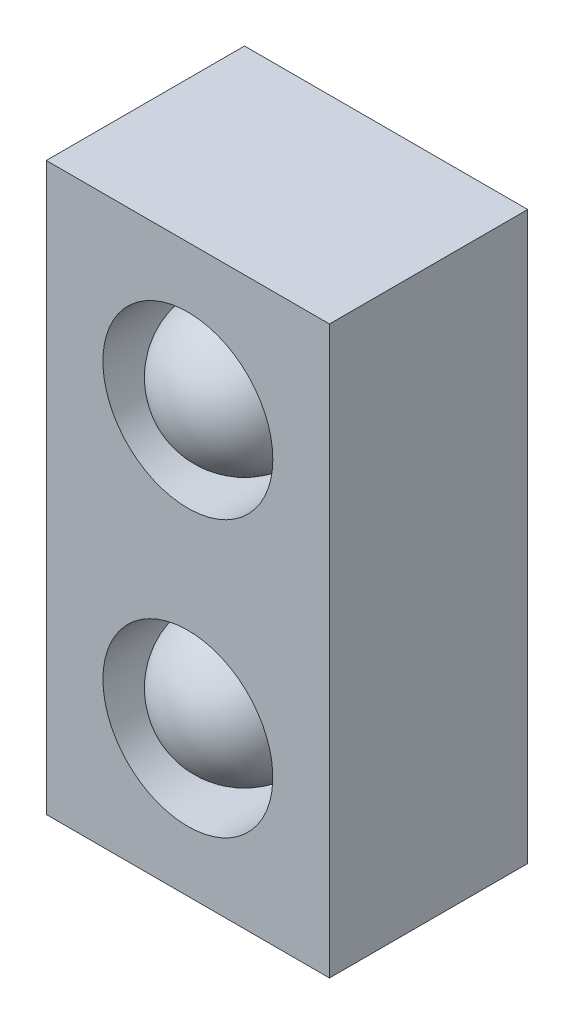
ISO-10303-21;
HEADER;
FILE_DESCRIPTION(('STEP AP214'),'2;1');
FILE_NAME('part.step','',(''),(''),'','','');
FILE_SCHEMA(('AUTOMOTIVE_DESIGN { 1 0 10303 214 1 1 1 1 }'));
ENDSEC;
DATA;
#1=APPLICATION_CONTEXT('core data for automotive mechanical design processes');
#2=APPLICATION_PROTOCOL_DEFINITION('international standard','automotive_design',2000,#1);
#3=PRODUCT_CONTEXT('',#1,'mechanical');
#4=PRODUCT('Part','Part','',(#3));
#5=PRODUCT_RELATED_PRODUCT_CATEGORY('part','',(#4));
#6=PRODUCT_DEFINITION_FORMATION('','',#4);
#7=PRODUCT_DEFINITION_CONTEXT('part definition',#1,'design');
#8=PRODUCT_DEFINITION('design','',#6,#7);
#9=PRODUCT_DEFINITION_SHAPE('','',#8);
#10=(LENGTH_UNIT() NAMED_UNIT(*) SI_UNIT(.MILLI.,.METRE.));
#11=(NAMED_UNIT(*) PLANE_ANGLE_UNIT() SI_UNIT($,.RADIAN.));
#12=(NAMED_UNIT(*) SI_UNIT($,.STERADIAN.) SOLID_ANGLE_UNIT());
#13=UNCERTAINTY_MEASURE_WITH_UNIT(LENGTH_MEASURE(1.E-05),#10,'distance_accuracy_value','');
#14=(GEOMETRIC_REPRESENTATION_CONTEXT(3) GLOBAL_UNCERTAINTY_ASSIGNED_CONTEXT((#13)) GLOBAL_UNIT_ASSIGNED_CONTEXT((#10,
#11,#12)) REPRESENTATION_CONTEXT('',''));
#15=CARTESIAN_POINT('',(0.,0.,0.));
#16=DIRECTION('',(0.,0.,1.));
#17=DIRECTION('',(1.,0.,0.));
#18=AXIS2_PLACEMENT_3D('',#15,#16,#17);
#19=CARTESIAN_POINT('',(0.,-4.63487276613991,5.));
#20=DIRECTION('',(0.,0.,-1.));
#21=DIRECTION('',(-1.,0.,0.));
#22=AXIS2_PLACEMENT_3D('',#19,#20,#21);
#23=CYLINDRICAL_SURFACE('',#22,2.5);
#24=CARTESIAN_POINT('',(0.,-4.63487276613991,5.));
#25=DIRECTION('',(0.,0.,-1.));
#26=DIRECTION('',(1.,0.,0.));
#27=AXIS2_PLACEMENT_3D('',#24,#25,#26);
#28=CIRCLE('',#27,2.5);
#29=CARTESIAN_POINT('',(2.5,-4.63487276613991,5.));
#30=VERTEX_POINT('',#29);
#31=EDGE_CURVE('E52',#30,#30,#28,.T.);
#32=ORIENTED_EDGE('',*,*,#31,.T.);
#33=EDGE_LOOP('',(#32));
#34=FACE_BOUND('',#33,.T.);
#35=CARTESIAN_POINT('',(0.,-4.63487276613991,0.));
#36=DIRECTION('',(0.,0.,-1.));
#37=DIRECTION('',(-1.,0.,0.));
#38=AXIS2_PLACEMENT_3D('',#35,#36,#37);
#39=CIRCLE('',#38,2.5);
#40=CARTESIAN_POINT('',(-2.5,-4.63487276613991,0.));
#41=VERTEX_POINT('',#40);
#42=EDGE_CURVE('E11',#41,#41,#39,.T.);
#43=ORIENTED_EDGE('',*,*,#42,.F.);
#44=EDGE_LOOP('',(#43));
#45=FACE_BOUND('',#44,.T.);
#46=ADVANCED_FACE('F46',(#34,#45),#23,.T.);
#47=CARTESIAN_POINT('',(0.,-4.63487276613991,0.));
#48=DIRECTION('',(0.,0.,-1.));
#49=DIRECTION('',(-1.,0.,0.));
#50=AXIS2_PLACEMENT_3D('',#47,#48,#49);
#51=PLANE('',#50);
#52=ORIENTED_EDGE('',*,*,#42,.T.);
#53=EDGE_LOOP('',(#52));
#54=FACE_BOUND('',#53,.T.);
#55=ADVANCED_FACE('F62',(#54),#51,.T.);
#56=CARTESIAN_POINT('',(0.,-4.63487276613991,5.));
#57=DIRECTION('',(-1.,0.,0.));
#58=DIRECTION('',(0.,-1.,0.));
#59=AXIS2_PLACEMENT_3D('',#56,#57,#58);
#60=SPHERICAL_SURFACE('',#59,2.5);
#61=CARTESIAN_POINT('',(0.,-4.63487276613991,5.));
#62=DIRECTION('',(0.,0.,-1.));
#63=DIRECTION('',(1.,0.,0.));
#64=AXIS2_PLACEMENT_3D('',#61,#62,#63);
#65=SPHERICAL_SURFACE('',#64,2.5);
#66=ORIENTED_EDGE('',*,*,#31,.F.);
#67=EDGE_LOOP('',(#66));
#68=FACE_BOUND('',#67,.T.);
#69=ADVANCED_FACE('F60',(#68),#65,.T.);
#70=CLOSED_SHELL('',(#46,#55,#69));
#71=MANIFOLD_SOLID_BREP('B2',#70);
#72=CARTESIAN_POINT('',(0.,4.86512723386009,5.));
#73=DIRECTION('',(0.,0.,-1.));
#74=DIRECTION('',(-1.,0.,0.));
#75=AXIS2_PLACEMENT_3D('',#72,#73,#74);
#76=CYLINDRICAL_SURFACE('',#75,2.5);
#77=CARTESIAN_POINT('',(0.,4.86512723386009,5.));
#78=DIRECTION('',(0.,0.,-1.));
#79=DIRECTION('',(1.,0.,0.));
#80=AXIS2_PLACEMENT_3D('',#77,#78,#79);
#81=CIRCLE('',#80,2.5);
#82=CARTESIAN_POINT('',(2.5,4.86512723386009,5.));
#83=VERTEX_POINT('',#82);
#84=EDGE_CURVE('E102',#83,#83,#81,.T.);
#85=ORIENTED_EDGE('',*,*,#84,.T.);
#86=EDGE_LOOP('',(#85));
#87=FACE_BOUND('',#86,.T.);
#88=CARTESIAN_POINT('',(0.,4.86512723386009,0.));
#89=DIRECTION('',(0.,0.,-1.));
#90=DIRECTION('',(-1.,0.,0.));
#91=AXIS2_PLACEMENT_3D('',#88,#89,#90);
#92=CIRCLE('',#91,2.5);
#93=CARTESIAN_POINT('',(-2.5,4.86512723386009,0.));
#94=VERTEX_POINT('',#93);
#95=EDGE_CURVE('E45',#94,#94,#92,.T.);
#96=ORIENTED_EDGE('',*,*,#95,.F.);
#97=EDGE_LOOP('',(#96));
#98=FACE_BOUND('',#97,.T.);
#99=ADVANCED_FACE('F96',(#87,#98),#76,.T.);
#100=CARTESIAN_POINT('',(0.,4.86512723386009,0.));
#101=DIRECTION('',(0.,0.,-1.));
#102=DIRECTION('',(-1.,0.,0.));
#103=AXIS2_PLACEMENT_3D('',#100,#101,#102);
#104=PLANE('',#103);
#105=ORIENTED_EDGE('',*,*,#95,.T.);
#106=EDGE_LOOP('',(#105));
#107=FACE_BOUND('',#106,.T.);
#108=ADVANCED_FACE('F112',(#107),#104,.T.);
#109=CARTESIAN_POINT('',(0.,4.86512723386009,5.));
#110=DIRECTION('',(-1.,0.,0.));
#111=DIRECTION('',(0.,-1.,0.));
#112=AXIS2_PLACEMENT_3D('',#109,#110,#111);
#113=SPHERICAL_SURFACE('',#112,2.5);
#114=CARTESIAN_POINT('',(0.,4.86512723386009,5.));
#115=DIRECTION('',(0.,0.,-1.));
#116=DIRECTION('',(1.,0.,0.));
#117=AXIS2_PLACEMENT_3D('',#114,#115,#116);
#118=SPHERICAL_SURFACE('',#117,2.5);
#119=ORIENTED_EDGE('',*,*,#84,.F.);
#120=EDGE_LOOP('',(#119));
#121=FACE_BOUND('',#120,.T.);
#122=ADVANCED_FACE('F110',(#121),#118,.T.);
#123=CLOSED_SHELL('',(#99,#108,#122));
#124=MANIFOLD_SOLID_BREP('B6',#123);
#125=CARTESIAN_POINT('',(0.,0.,7.));
#126=DIRECTION('',(0.,0.,-1.));
#127=DIRECTION('',(-1.,0.,0.));
#128=AXIS2_PLACEMENT_3D('',#125,#126,#127);
#129=PLANE('',#128);
#130=DIRECTION('',(0.,1.,0.));
#131=VECTOR('',#130,1.);
#132=CARTESIAN_POINT('',(5.,-10.,7.));
#133=LINE('',#132,#131);
#134=CARTESIAN_POINT('',(5.,-10.,7.));
#135=VERTEX_POINT('',#134);
#136=CARTESIAN_POINT('',(5.,10.,7.));
#137=VERTEX_POINT('',#136);
#138=EDGE_CURVE('E189',#135,#137,#133,.T.);
#139=ORIENTED_EDGE('',*,*,#138,.T.);
#140=DIRECTION('',(-1.,0.,0.));
#141=VECTOR('',#140,1.);
#142=CARTESIAN_POINT('',(-5.,10.,7.));
#143=LINE('',#142,#141);
#144=CARTESIAN_POINT('',(-5.,10.,7.));
#145=VERTEX_POINT('',#144);
#146=EDGE_CURVE('E184',#137,#145,#143,.T.);
#147=ORIENTED_EDGE('',*,*,#146,.T.);
#148=DIRECTION('',(0.,-1.,0.));
#149=VECTOR('',#148,1.);
#150=CARTESIAN_POINT('',(-5.,-10.,7.));
#151=LINE('',#150,#149);
#152=CARTESIAN_POINT('',(-5.,-10.,7.));
#153=VERTEX_POINT('',#152);
#154=EDGE_CURVE('E187',#145,#153,#151,.T.);
#155=ORIENTED_EDGE('',*,*,#154,.T.);
#156=DIRECTION('',(1.,0.,0.));
#157=VECTOR('',#156,1.);
#158=CARTESIAN_POINT('',(-5.,-10.,7.));
#159=LINE('',#158,#157);
#160=EDGE_CURVE('E154',#153,#135,#159,.T.);
#161=ORIENTED_EDGE('',*,*,#160,.T.);
#162=EDGE_LOOP('',(#139,#147,#155,#161));
#163=FACE_BOUND('',#162,.T.);
#164=CARTESIAN_POINT('',(0.,4.86512723386009,7.));
#165=DIRECTION('',(0.,0.,1.));
#166=DIRECTION('',(1.,0.,0.));
#167=AXIS2_PLACEMENT_3D('',#164,#165,#166);
#168=CIRCLE('',#167,3.);
#169=CARTESIAN_POINT('',(3.,4.86512723386009,7.));
#170=VERTEX_POINT('',#169);
#171=EDGE_CURVE('E204',#170,#170,#168,.T.);
#172=ORIENTED_EDGE('',*,*,#171,.F.);
#173=EDGE_LOOP('',(#172));
#174=FACE_BOUND('',#173,.T.);
#175=CARTESIAN_POINT('',(0.,-4.86512723386009,7.));
#176=DIRECTION('',(0.,0.,1.));
#177=DIRECTION('',(-1.,0.,0.));
#178=AXIS2_PLACEMENT_3D('',#175,#176,#177);
#179=CIRCLE('',#178,3.);
#180=CARTESIAN_POINT('',(-3.,-4.86512723386009,7.));
#181=VERTEX_POINT('',#180);
#182=EDGE_CURVE('E219',#181,#181,#179,.T.);
#183=ORIENTED_EDGE('',*,*,#182,.F.);
#184=EDGE_LOOP('',(#183));
#185=FACE_BOUND('',#184,.T.);
#186=ADVANCED_FACE('F137',(#163,#174,#185),#129,.F.);
#187=CARTESIAN_POINT('',(0.,0.,0.));
#188=DIRECTION('',(0.,0.,-1.));
#189=DIRECTION('',(-1.,0.,0.));
#190=AXIS2_PLACEMENT_3D('',#187,#188,#189);
#191=PLANE('',#190);
#192=CARTESIAN_POINT('',(0.,4.86512723386009,0.));
#193=DIRECTION('',(0.,0.,1.));
#194=DIRECTION('',(1.,0.,0.));
#195=AXIS2_PLACEMENT_3D('',#192,#193,#194);
#196=CIRCLE('',#195,3.);
#197=CARTESIAN_POINT('',(3.,4.86512723386009,0.));
#198=VERTEX_POINT('',#197);
#199=EDGE_CURVE('E216',#198,#198,#196,.T.);
#200=ORIENTED_EDGE('',*,*,#199,.T.);
#201=EDGE_LOOP('',(#200));
#202=FACE_BOUND('',#201,.T.);
#203=DIRECTION('',(0.,1.,0.));
#204=VECTOR('',#203,1.);
#205=CARTESIAN_POINT('',(5.,-10.,0.));
#206=LINE('',#205,#204);
#207=CARTESIAN_POINT('',(5.,-10.,0.));
#208=VERTEX_POINT('',#207);
#209=CARTESIAN_POINT('',(5.,10.,0.));
#210=VERTEX_POINT('',#209);
#211=EDGE_CURVE('E201',#208,#210,#206,.T.);
#212=ORIENTED_EDGE('',*,*,#211,.F.);
#213=DIRECTION('',(1.,0.,0.));
#214=VECTOR('',#213,1.);
#215=CARTESIAN_POINT('',(-5.,-10.,0.));
#216=LINE('',#215,#214);
#217=CARTESIAN_POINT('',(-5.,-10.,0.));
#218=VERTEX_POINT('',#217);
#219=EDGE_CURVE('E177',#218,#208,#216,.T.);
#220=ORIENTED_EDGE('',*,*,#219,.F.);
#221=DIRECTION('',(0.,-1.,0.));
#222=VECTOR('',#221,1.);
#223=CARTESIAN_POINT('',(-5.,-10.,0.));
#224=LINE('',#223,#222);
#225=CARTESIAN_POINT('',(-5.,10.,0.));
#226=VERTEX_POINT('',#225);
#227=EDGE_CURVE('E171',#226,#218,#224,.T.);
#228=ORIENTED_EDGE('',*,*,#227,.F.);
#229=DIRECTION('',(-1.,0.,0.));
#230=VECTOR('',#229,1.);
#231=CARTESIAN_POINT('',(-5.,10.,0.));
#232=LINE('',#231,#230);
#233=EDGE_CURVE('E193',#210,#226,#232,.T.);
#234=ORIENTED_EDGE('',*,*,#233,.F.);
#235=EDGE_LOOP('',(#212,#220,#228,#234));
#236=FACE_BOUND('',#235,.T.);
#237=CARTESIAN_POINT('',(0.,-4.86512723386009,0.));
#238=DIRECTION('',(0.,0.,1.));
#239=DIRECTION('',(-1.,0.,0.));
#240=AXIS2_PLACEMENT_3D('',#237,#238,#239);
#241=CIRCLE('',#240,3.);
#242=CARTESIAN_POINT('',(-3.,-4.86512723386009,0.));
#243=VERTEX_POINT('',#242);
#244=EDGE_CURVE('E222',#243,#243,#241,.T.);
#245=ORIENTED_EDGE('',*,*,#244,.T.);
#246=EDGE_LOOP('',(#245));
#247=FACE_BOUND('',#246,.T.);
#248=ADVANCED_FACE('F212',(#202,#236,#247),#191,.T.);
#249=CARTESIAN_POINT('',(5.,-10.,7.));
#250=DIRECTION('',(-1.,0.,0.));
#251=DIRECTION('',(0.,0.,1.));
#252=AXIS2_PLACEMENT_3D('',#249,#250,#251);
#253=PLANE('',#252);
#254=ORIENTED_EDGE('',*,*,#211,.T.);
#255=DIRECTION('',(0.,0.,-1.));
#256=VECTOR('',#255,1.);
#257=CARTESIAN_POINT('',(5.,10.,7.));
#258=LINE('',#257,#256);
#259=EDGE_CURVE('E94',#137,#210,#258,.T.);
#260=ORIENTED_EDGE('',*,*,#259,.F.);
#261=ORIENTED_EDGE('',*,*,#138,.F.);
#262=DIRECTION('',(0.,0.,-1.));
#263=VECTOR('',#262,1.);
#264=CARTESIAN_POINT('',(5.,-10.,7.));
#265=LINE('',#264,#263);
#266=EDGE_CURVE('E197',#135,#208,#265,.T.);
#267=ORIENTED_EDGE('',*,*,#266,.T.);
#268=EDGE_LOOP('',(#254,#260,#261,#267));
#269=FACE_BOUND('',#268,.T.);
#270=ADVANCED_FACE('F139',(#269),#253,.F.);
#271=CARTESIAN_POINT('',(-5.,10.,7.));
#272=DIRECTION('',(0.,-1.,0.));
#273=DIRECTION('',(0.,0.,-1.));
#274=AXIS2_PLACEMENT_3D('',#271,#272,#273);
#275=PLANE('',#274);
#276=ORIENTED_EDGE('',*,*,#233,.T.);
#277=DIRECTION('',(0.,0.,-1.));
#278=VECTOR('',#277,1.);
#279=CARTESIAN_POINT('',(-5.,10.,7.));
#280=LINE('',#279,#278);
#281=EDGE_CURVE('E146',#145,#226,#280,.T.);
#282=ORIENTED_EDGE('',*,*,#281,.F.);
#283=ORIENTED_EDGE('',*,*,#146,.F.);
#284=ORIENTED_EDGE('',*,*,#259,.T.);
#285=EDGE_LOOP('',(#276,#282,#283,#284));
#286=FACE_BOUND('',#285,.T.);
#287=ADVANCED_FACE('F192',(#286),#275,.F.);
#288=CARTESIAN_POINT('',(-5.,-10.,7.));
#289=DIRECTION('',(1.,0.,0.));
#290=DIRECTION('',(0.,0.,-1.));
#291=AXIS2_PLACEMENT_3D('',#288,#289,#290);
#292=PLANE('',#291);
#293=ORIENTED_EDGE('',*,*,#227,.T.);
#294=DIRECTION('',(0.,0.,-1.));
#295=VECTOR('',#294,1.);
#296=CARTESIAN_POINT('',(-5.,-10.,7.));
#297=LINE('',#296,#295);
#298=EDGE_CURVE('E194',#153,#218,#297,.T.);
#299=ORIENTED_EDGE('',*,*,#298,.F.);
#300=ORIENTED_EDGE('',*,*,#154,.F.);
#301=ORIENTED_EDGE('',*,*,#281,.T.);
#302=EDGE_LOOP('',(#293,#299,#300,#301));
#303=FACE_BOUND('',#302,.T.);
#304=ADVANCED_FACE('F195',(#303),#292,.F.);
#305=CARTESIAN_POINT('',(-5.,-10.,7.));
#306=DIRECTION('',(0.,1.,0.));
#307=DIRECTION('',(0.,0.,1.));
#308=AXIS2_PLACEMENT_3D('',#305,#306,#307);
#309=PLANE('',#308);
#310=ORIENTED_EDGE('',*,*,#219,.T.);
#311=ORIENTED_EDGE('',*,*,#266,.F.);
#312=ORIENTED_EDGE('',*,*,#160,.F.);
#313=ORIENTED_EDGE('',*,*,#298,.T.);
#314=EDGE_LOOP('',(#310,#311,#312,#313));
#315=FACE_BOUND('',#314,.T.);
#316=ADVANCED_FACE('F209',(#315),#309,.F.);
#317=CARTESIAN_POINT('',(0.,4.86512723386009,7.));
#318=DIRECTION('',(0.,0.,-1.));
#319=DIRECTION('',(-1.,0.,0.));
#320=AXIS2_PLACEMENT_3D('',#317,#318,#319);
#321=CYLINDRICAL_SURFACE('',#320,3.);
#322=ORIENTED_EDGE('',*,*,#171,.T.);
#323=EDGE_LOOP('',(#322));
#324=FACE_BOUND('',#323,.T.);
#325=ORIENTED_EDGE('',*,*,#199,.F.);
#326=EDGE_LOOP('',(#325));
#327=FACE_BOUND('',#326,.T.);
#328=ADVANCED_FACE('F239',(#324,#327),#321,.F.);
#329=CARTESIAN_POINT('',(0.,-4.86512723386009,7.));
#330=DIRECTION('',(0.,0.,-1.));
#331=DIRECTION('',(-1.,0.,0.));
#332=AXIS2_PLACEMENT_3D('',#329,#330,#331);
#333=CYLINDRICAL_SURFACE('',#332,3.);
#334=ORIENTED_EDGE('',*,*,#182,.T.);
#335=EDGE_LOOP('',(#334));
#336=FACE_BOUND('',#335,.T.);
#337=ORIENTED_EDGE('',*,*,#244,.F.);
#338=EDGE_LOOP('',(#337));
#339=FACE_BOUND('',#338,.T.);
#340=ADVANCED_FACE('F228',(#336,#339),#333,.F.);
#341=CLOSED_SHELL('',(#186,#248,#270,#287,#304,#316,#328,#340));
#342=MANIFOLD_SOLID_BREP('B40',#341);
#343=ADVANCED_BREP_SHAPE_REPRESENTATION('',(#18,#71,#124,#342),#14);
#344=SHAPE_DEFINITION_REPRESENTATION(#9,#343);
ENDSEC;
END-ISO-10303-21;
